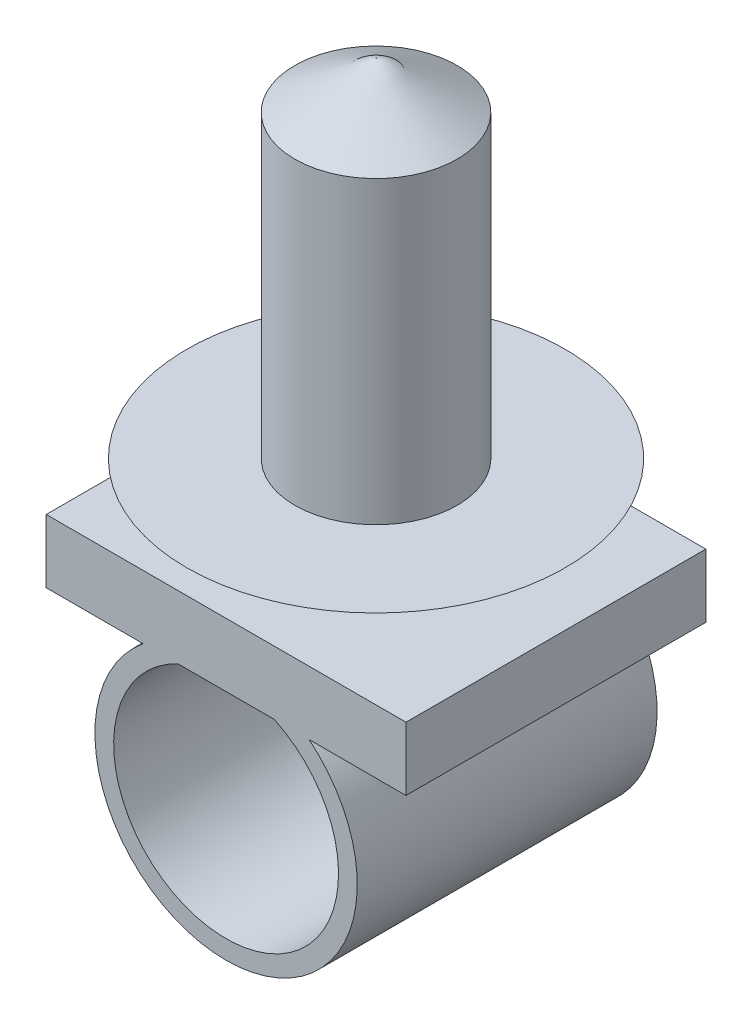
ISO-10303-21;
HEADER;
FILE_DESCRIPTION(('STEP AP214'),'2;1');
FILE_NAME('part.step','',(''),(''),'','','');
FILE_SCHEMA(('AUTOMOTIVE_DESIGN { 1 0 10303 214 1 1 1 1 }'));
ENDSEC;
DATA;
#1=APPLICATION_CONTEXT('core data for automotive mechanical design processes');
#2=APPLICATION_PROTOCOL_DEFINITION('international standard','automotive_design',2000,#1);
#3=PRODUCT_CONTEXT('',#1,'mechanical');
#4=PRODUCT('Part','Part','',(#3));
#5=PRODUCT_RELATED_PRODUCT_CATEGORY('part','',(#4));
#6=PRODUCT_DEFINITION_FORMATION('','',#4);
#7=PRODUCT_DEFINITION_CONTEXT('part definition',#1,'design');
#8=PRODUCT_DEFINITION('design','',#6,#7);
#9=PRODUCT_DEFINITION_SHAPE('','',#8);
#10=(LENGTH_UNIT() NAMED_UNIT(*) SI_UNIT(.MILLI.,.METRE.));
#11=(NAMED_UNIT(*) PLANE_ANGLE_UNIT() SI_UNIT($,.RADIAN.));
#12=(NAMED_UNIT(*) SI_UNIT($,.STERADIAN.) SOLID_ANGLE_UNIT());
#13=UNCERTAINTY_MEASURE_WITH_UNIT(LENGTH_MEASURE(1.E-05),#10,'distance_accuracy_value','');
#14=(GEOMETRIC_REPRESENTATION_CONTEXT(3) GLOBAL_UNCERTAINTY_ASSIGNED_CONTEXT((#13)) GLOBAL_UNIT_ASSIGNED_CONTEXT((#10,
#11,#12)) REPRESENTATION_CONTEXT('',''));
#15=CARTESIAN_POINT('',(0.,0.,0.));
#16=DIRECTION('',(0.,0.,1.));
#17=DIRECTION('',(1.,0.,0.));
#18=AXIS2_PLACEMENT_3D('',#15,#16,#17);
#19=CARTESIAN_POINT('',(0.,0.,12.));
#20=DIRECTION('',(0.,0.,1.));
#21=DIRECTION('',(1.,0.,0.));
#22=AXIS2_PLACEMENT_3D('',#19,#20,#21);
#23=PLANE('',#22);
#24=CARTESIAN_POINT('',(0.,0.,12.));
#25=DIRECTION('',(0.,0.,1.));
#26=DIRECTION('',(1.,0.,0.));
#27=AXIS2_PLACEMENT_3D('',#24,#25,#26);
#28=CIRCLE('',#27,4.5);
#29=CARTESIAN_POINT('',(-1.93233123454546,4.064,12.));
#30=VERTEX_POINT('',#29);
#31=CARTESIAN_POINT('',(1.93233123454546,4.064,12.));
#32=VERTEX_POINT('',#31);
#33=EDGE_CURVE('E185',#30,#32,#28,.T.);
#34=ORIENTED_EDGE('',*,*,#33,.F.);
#35=DIRECTION('',(1.,0.,0.));
#36=VECTOR('',#35,1.);
#37=CARTESIAN_POINT('',(7.2,4.064,12.));
#38=LINE('',#37,#36);
#39=EDGE_CURVE('E155',#30,#32,#38,.T.);
#40=ORIENTED_EDGE('',*,*,#39,.T.);
#41=EDGE_LOOP('',(#34,#40));
#42=FACE_BOUND('',#41,.T.);
#43=CARTESIAN_POINT('',(-7.2,4.064,12.));
#44=VERTEX_POINT('',#43);
#45=CARTESIAN_POINT('',(-3.32361309420937,4.064,12.));
#46=VERTEX_POINT('',#45);
#47=EDGE_CURVE('E150',#44,#46,#38,.T.);
#48=ORIENTED_EDGE('',*,*,#47,.T.);
#49=CARTESIAN_POINT('',(0.,0.,12.));
#50=DIRECTION('',(0.,0.,1.));
#51=DIRECTION('',(1.,0.,0.));
#52=AXIS2_PLACEMENT_3D('',#49,#50,#51);
#53=CIRCLE('',#52,5.25);
#54=CARTESIAN_POINT('',(3.32361309420937,4.064,12.));
#55=VERTEX_POINT('',#54);
#56=EDGE_CURVE('E191',#46,#55,#53,.T.);
#57=ORIENTED_EDGE('',*,*,#56,.T.);
#58=CARTESIAN_POINT('',(7.2,4.064,12.));
#59=VERTEX_POINT('',#58);
#60=EDGE_CURVE('E61',#55,#59,#38,.T.);
#61=ORIENTED_EDGE('',*,*,#60,.T.);
#62=DIRECTION('',(0.,-1.,0.));
#63=VECTOR('',#62,1.);
#64=CARTESIAN_POINT('',(7.2,6.604,12.));
#65=LINE('',#64,#63);
#66=CARTESIAN_POINT('',(7.2,6.604,12.));
#67=VERTEX_POINT('',#66);
#68=EDGE_CURVE('E166',#67,#59,#65,.T.);
#69=ORIENTED_EDGE('',*,*,#68,.F.);
#70=DIRECTION('',(1.,0.,0.));
#71=VECTOR('',#70,1.);
#72=CARTESIAN_POINT('',(7.2,6.604,12.));
#73=LINE('',#72,#71);
#74=CARTESIAN_POINT('',(-7.2,6.604,12.));
#75=VERTEX_POINT('',#74);
#76=EDGE_CURVE('E140',#75,#67,#73,.T.);
#77=ORIENTED_EDGE('',*,*,#76,.F.);
#78=DIRECTION('',(0.,-1.,0.));
#79=VECTOR('',#78,1.);
#80=CARTESIAN_POINT('',(-7.2,6.604,12.));
#81=LINE('',#80,#79);
#82=EDGE_CURVE('E170',#75,#44,#81,.T.);
#83=ORIENTED_EDGE('',*,*,#82,.T.);
#84=EDGE_LOOP('',(#48,#57,#61,#69,#77,#83));
#85=FACE_BOUND('',#84,.T.);
#86=ADVANCED_FACE('F43',(#42,#85),#23,.T.);
#87=CARTESIAN_POINT('',(0.,0.,0.));
#88=DIRECTION('',(0.,0.,1.));
#89=DIRECTION('',(1.,0.,0.));
#90=AXIS2_PLACEMENT_3D('',#87,#88,#89);
#91=PLANE('',#90);
#92=DIRECTION('',(-1.,0.,0.));
#93=VECTOR('',#92,1.);
#94=CARTESIAN_POINT('',(0.,4.064,0.));
#95=LINE('',#94,#93);
#96=CARTESIAN_POINT('',(1.93233123454546,4.064,0.));
#97=VERTEX_POINT('',#96);
#98=CARTESIAN_POINT('',(-1.93233123454546,4.064,0.));
#99=VERTEX_POINT('',#98);
#100=EDGE_CURVE('E162',#97,#99,#95,.T.);
#101=ORIENTED_EDGE('',*,*,#100,.T.);
#102=CARTESIAN_POINT('',(0.,0.,0.));
#103=DIRECTION('',(0.,0.,1.));
#104=DIRECTION('',(1.,0.,0.));
#105=AXIS2_PLACEMENT_3D('',#102,#103,#104);
#106=CIRCLE('',#105,4.5);
#107=EDGE_CURVE('E69',#99,#97,#106,.T.);
#108=ORIENTED_EDGE('',*,*,#107,.T.);
#109=EDGE_LOOP('',(#101,#108));
#110=FACE_BOUND('',#109,.T.);
#111=CARTESIAN_POINT('',(0.,0.,0.));
#112=DIRECTION('',(0.,0.,1.));
#113=DIRECTION('',(1.,0.,0.));
#114=AXIS2_PLACEMENT_3D('',#111,#112,#113);
#115=CIRCLE('',#114,5.25);
#116=CARTESIAN_POINT('',(-3.32361309420937,4.064,0.));
#117=VERTEX_POINT('',#116);
#118=CARTESIAN_POINT('',(3.32361309420937,4.064,0.));
#119=VERTEX_POINT('',#118);
#120=EDGE_CURVE('E188',#117,#119,#115,.T.);
#121=ORIENTED_EDGE('',*,*,#120,.F.);
#122=CARTESIAN_POINT('',(-7.2,4.064,0.));
#123=VERTEX_POINT('',#122);
#124=EDGE_CURVE('E158',#117,#123,#95,.T.);
#125=ORIENTED_EDGE('',*,*,#124,.T.);
#126=DIRECTION('',(0.,-1.,0.));
#127=VECTOR('',#126,1.);
#128=CARTESIAN_POINT('',(-7.2,6.604,0.));
#129=LINE('',#128,#127);
#130=CARTESIAN_POINT('',(-7.2,6.604,0.));
#131=VERTEX_POINT('',#130);
#132=EDGE_CURVE('E174',#131,#123,#129,.T.);
#133=ORIENTED_EDGE('',*,*,#132,.F.);
#134=DIRECTION('',(-1.,0.,0.));
#135=VECTOR('',#134,1.);
#136=CARTESIAN_POINT('',(-7.2,6.604,0.));
#137=LINE('',#136,#135);
#138=CARTESIAN_POINT('',(7.2,6.604,0.));
#139=VERTEX_POINT('',#138);
#140=EDGE_CURVE('E132',#139,#131,#137,.T.);
#141=ORIENTED_EDGE('',*,*,#140,.F.);
#142=DIRECTION('',(0.,-1.,0.));
#143=VECTOR('',#142,1.);
#144=CARTESIAN_POINT('',(7.2,6.604,0.));
#145=LINE('',#144,#143);
#146=CARTESIAN_POINT('',(7.2,4.064,0.));
#147=VERTEX_POINT('',#146);
#148=EDGE_CURVE('E147',#139,#147,#145,.T.);
#149=ORIENTED_EDGE('',*,*,#148,.T.);
#150=EDGE_CURVE('E137',#147,#119,#95,.T.);
#151=ORIENTED_EDGE('',*,*,#150,.T.);
#152=EDGE_LOOP('',(#121,#125,#133,#141,#149,#151));
#153=FACE_BOUND('',#152,.T.);
#154=ADVANCED_FACE('F209',(#110,#153),#91,.F.);
#155=CARTESIAN_POINT('',(0.,0.,12.));
#156=DIRECTION('',(0.,0.,-1.));
#157=DIRECTION('',(-1.,0.,0.));
#158=AXIS2_PLACEMENT_3D('',#155,#156,#157);
#159=CYLINDRICAL_SURFACE('',#158,5.25);
#160=ORIENTED_EDGE('',*,*,#56,.F.);
#161=DIRECTION('',(0.,0.,-1.));
#162=VECTOR('',#161,1.);
#163=CARTESIAN_POINT('',(-3.32361309420937,4.064,12.));
#164=LINE('',#163,#162);
#165=EDGE_CURVE('E181',#46,#117,#164,.T.);
#166=ORIENTED_EDGE('',*,*,#165,.T.);
#167=ORIENTED_EDGE('',*,*,#120,.T.);
#168=DIRECTION('',(0.,0.,-1.));
#169=VECTOR('',#168,1.);
#170=CARTESIAN_POINT('',(3.32361309420937,4.064,12.));
#171=LINE('',#170,#169);
#172=EDGE_CURVE('E178',#119,#55,#171,.F.);
#173=ORIENTED_EDGE('',*,*,#172,.T.);
#174=EDGE_LOOP('',(#160,#166,#167,#173));
#175=FACE_BOUND('',#174,.T.);
#176=ADVANCED_FACE('F45',(#175),#159,.T.);
#177=CARTESIAN_POINT('',(0.,0.,12.));
#178=DIRECTION('',(0.,0.,-1.));
#179=DIRECTION('',(-1.,0.,0.));
#180=AXIS2_PLACEMENT_3D('',#177,#178,#179);
#181=CYLINDRICAL_SURFACE('',#180,4.5);
#182=DIRECTION('',(0.,0.,-1.));
#183=VECTOR('',#182,1.);
#184=CARTESIAN_POINT('',(-1.93233123454546,4.064,12.));
#185=LINE('',#184,#183);
#186=EDGE_CURVE('E47',#30,#99,#185,.T.);
#187=ORIENTED_EDGE('',*,*,#186,.F.);
#188=ORIENTED_EDGE('',*,*,#33,.T.);
#189=DIRECTION('',(0.,0.,-1.));
#190=VECTOR('',#189,1.);
#191=CARTESIAN_POINT('',(1.93233123454546,4.064,12.));
#192=LINE('',#191,#190);
#193=EDGE_CURVE('E195',#97,#32,#192,.F.);
#194=ORIENTED_EDGE('',*,*,#193,.F.);
#195=ORIENTED_EDGE('',*,*,#107,.F.);
#196=EDGE_LOOP('',(#187,#188,#194,#195));
#197=FACE_BOUND('',#196,.T.);
#198=ADVANCED_FACE('F253',(#197),#181,.F.);
#199=CARTESIAN_POINT('',(0.,4.064,0.));
#200=DIRECTION('',(0.,-1.,0.));
#201=DIRECTION('',(0.,0.,-1.));
#202=AXIS2_PLACEMENT_3D('',#199,#200,#201);
#203=PLANE('',#202);
#204=ORIENTED_EDGE('',*,*,#39,.F.);
#205=ORIENTED_EDGE('',*,*,#186,.T.);
#206=ORIENTED_EDGE('',*,*,#100,.F.);
#207=ORIENTED_EDGE('',*,*,#193,.T.);
#208=EDGE_LOOP('',(#204,#205,#206,#207));
#209=FACE_BOUND('',#208,.T.);
#210=ADVANCED_FACE('F206',(#209),#203,.T.);
#211=ORIENTED_EDGE('',*,*,#165,.F.);
#212=ORIENTED_EDGE('',*,*,#47,.F.);
#213=DIRECTION('',(0.,0.,1.));
#214=VECTOR('',#213,1.);
#215=CARTESIAN_POINT('',(-7.2,4.064,12.));
#216=LINE('',#215,#214);
#217=EDGE_CURVE('E126',#123,#44,#216,.T.);
#218=ORIENTED_EDGE('',*,*,#217,.F.);
#219=ORIENTED_EDGE('',*,*,#124,.F.);
#220=EDGE_LOOP('',(#211,#212,#218,#219));
#221=FACE_BOUND('',#220,.T.);
#222=ADVANCED_FACE('F218',(#221),#203,.T.);
#223=ORIENTED_EDGE('',*,*,#172,.F.);
#224=ORIENTED_EDGE('',*,*,#150,.F.);
#225=DIRECTION('',(0.,0.,-1.));
#226=VECTOR('',#225,1.);
#227=CARTESIAN_POINT('',(7.2,4.064,0.));
#228=LINE('',#227,#226);
#229=EDGE_CURVE('E154',#59,#147,#228,.T.);
#230=ORIENTED_EDGE('',*,*,#229,.F.);
#231=ORIENTED_EDGE('',*,*,#60,.F.);
#232=EDGE_LOOP('',(#223,#224,#230,#231));
#233=FACE_BOUND('',#232,.T.);
#234=ADVANCED_FACE('F229',(#233),#203,.T.);
#235=CARTESIAN_POINT('',(-7.2,6.604,12.));
#236=DIRECTION('',(1.,0.,0.));
#237=DIRECTION('',(0.,0.,-1.));
#238=AXIS2_PLACEMENT_3D('',#235,#236,#237);
#239=PLANE('',#238);
#240=ORIENTED_EDGE('',*,*,#217,.T.);
#241=ORIENTED_EDGE('',*,*,#82,.F.);
#242=DIRECTION('',(0.,0.,1.));
#243=VECTOR('',#242,1.);
#244=CARTESIAN_POINT('',(-7.2,6.604,12.));
#245=LINE('',#244,#243);
#246=EDGE_CURVE('E136',#131,#75,#245,.T.);
#247=ORIENTED_EDGE('',*,*,#246,.F.);
#248=ORIENTED_EDGE('',*,*,#132,.T.);
#249=EDGE_LOOP('',(#240,#241,#247,#248));
#250=FACE_BOUND('',#249,.T.);
#251=ADVANCED_FACE('F221',(#250),#239,.F.);
#252=CARTESIAN_POINT('',(7.2,6.604,0.));
#253=DIRECTION('',(-1.,0.,0.));
#254=DIRECTION('',(0.,0.,1.));
#255=AXIS2_PLACEMENT_3D('',#252,#253,#254);
#256=PLANE('',#255);
#257=ORIENTED_EDGE('',*,*,#229,.T.);
#258=ORIENTED_EDGE('',*,*,#148,.F.);
#259=DIRECTION('',(0.,0.,-1.));
#260=VECTOR('',#259,1.);
#261=CARTESIAN_POINT('',(7.2,6.604,0.));
#262=LINE('',#261,#260);
#263=EDGE_CURVE('E143',#67,#139,#262,.T.);
#264=ORIENTED_EDGE('',*,*,#263,.F.);
#265=ORIENTED_EDGE('',*,*,#68,.T.);
#266=EDGE_LOOP('',(#257,#258,#264,#265));
#267=FACE_BOUND('',#266,.T.);
#268=ADVANCED_FACE('F234',(#267),#256,.F.);
#269=CARTESIAN_POINT('',(0.,6.604,0.));
#270=DIRECTION('',(0.,-1.,0.));
#271=DIRECTION('',(0.,0.,-1.));
#272=AXIS2_PLACEMENT_3D('',#269,#270,#271);
#273=PLANE('',#272);
#274=CARTESIAN_POINT('',(0.,6.604,6.));
#275=DIRECTION('',(0.,1.,0.));
#276=DIRECTION('',(0.,0.,1.));
#277=AXIS2_PLACEMENT_3D('',#274,#275,#276);
#278=CIRCLE('',#277,3.175);
#279=CARTESIAN_POINT('',(0.,6.604,9.175));
#280=VERTEX_POINT('',#279);
#281=EDGE_CURVE('E53',#280,#280,#278,.T.);
#282=ORIENTED_EDGE('',*,*,#281,.F.);
#283=EDGE_LOOP('',(#282));
#284=FACE_BOUND('',#283,.T.);
#285=ORIENTED_EDGE('',*,*,#140,.T.);
#286=ORIENTED_EDGE('',*,*,#246,.T.);
#287=ORIENTED_EDGE('',*,*,#76,.T.);
#288=ORIENTED_EDGE('',*,*,#263,.T.);
#289=EDGE_LOOP('',(#285,#286,#287,#288));
#290=FACE_BOUND('',#289,.T.);
#291=ADVANCED_FACE('F224',(#284,#290),#273,.F.);
#292=CARTESIAN_POINT('',(0.,6.604,6.));
#293=DIRECTION('',(0.,1.,0.));
#294=DIRECTION('',(0.,0.,1.));
#295=AXIS2_PLACEMENT_3D('',#292,#293,#294);
#296=CONICAL_SURFACE('',#295,3.175,1.0471975511966);
#297=CARTESIAN_POINT('',(0.,9.144,6.));
#298=DIRECTION('',(0.,1.,0.));
#299=DIRECTION('',(0.,0.,1.));
#300=AXIS2_PLACEMENT_3D('',#297,#298,#299);
#301=CIRCLE('',#300,7.57440905122497);
#302=CARTESIAN_POINT('',(0.,9.144,13.574409051225));
#303=VERTEX_POINT('',#302);
#304=EDGE_CURVE('E122',#303,#303,#301,.T.);
#305=ORIENTED_EDGE('',*,*,#304,.F.);
#306=EDGE_LOOP('',(#305));
#307=FACE_BOUND('',#306,.T.);
#308=ORIENTED_EDGE('',*,*,#281,.T.);
#309=EDGE_LOOP('',(#308));
#310=FACE_BOUND('',#309,.T.);
#311=ADVANCED_FACE('F241',(#307,#310),#296,.T.);
#312=CARTESIAN_POINT('',(0.,9.144,6.));
#313=DIRECTION('',(0.,1.,0.));
#314=DIRECTION('',(0.,0.,1.));
#315=AXIS2_PLACEMENT_3D('',#312,#313,#314);
#316=PLANE('',#315);
#317=CARTESIAN_POINT('',(0.,9.144,6.));
#318=DIRECTION('',(0.,1.,0.));
#319=DIRECTION('',(0.,0.,1.));
#320=AXIS2_PLACEMENT_3D('',#317,#318,#319);
#321=CIRCLE('',#320,3.25);
#322=CARTESIAN_POINT('',(0.,9.144,9.25));
#323=VERTEX_POINT('',#322);
#324=EDGE_CURVE('E11',#323,#323,#321,.T.);
#325=ORIENTED_EDGE('',*,*,#324,.F.);
#326=EDGE_LOOP('',(#325));
#327=FACE_BOUND('',#326,.T.);
#328=ORIENTED_EDGE('',*,*,#304,.T.);
#329=EDGE_LOOP('',(#328));
#330=FACE_BOUND('',#329,.T.);
#331=ADVANCED_FACE('F336',(#327,#330),#316,.T.);
#332=CARTESIAN_POINT('',(0.,21.144,6.));
#333=DIRECTION('',(0.,-1.,0.));
#334=DIRECTION('',(0.,0.,-1.));
#335=AXIS2_PLACEMENT_3D('',#332,#333,#334);
#336=CYLINDRICAL_SURFACE('',#335,3.25);
#337=CARTESIAN_POINT('',(0.,21.144,6.));
#338=DIRECTION('',(0.,1.,0.));
#339=DIRECTION('',(0.,0.,1.));
#340=AXIS2_PLACEMENT_3D('',#337,#338,#339);
#341=CIRCLE('',#340,3.25);
#342=CARTESIAN_POINT('',(0.,21.144,9.25));
#343=VERTEX_POINT('',#342);
#344=EDGE_CURVE('E119',#343,#343,#341,.T.);
#345=ORIENTED_EDGE('',*,*,#344,.F.);
#346=EDGE_LOOP('',(#345));
#347=FACE_BOUND('',#346,.T.);
#348=ORIENTED_EDGE('',*,*,#324,.T.);
#349=EDGE_LOOP('',(#348));
#350=FACE_BOUND('',#349,.T.);
#351=ADVANCED_FACE('F115',(#347,#350),#336,.T.);
#352=CARTESIAN_POINT('',(0.,21.144,6.));
#353=DIRECTION('',(0.,-1.,0.));
#354=DIRECTION('',(0.,0.,1.));
#355=AXIS2_PLACEMENT_3D('',#352,#353,#354);
#356=CONICAL_SURFACE('',#355,3.25,1.0471975511966);
#357=CARTESIAN_POINT('',(0.,23.0203883748663,6.));
#358=VERTEX_POINT('',#357);
#359=VERTEX_LOOP('',#358);
#360=FACE_BOUND('',#359,.T.);
#361=ORIENTED_EDGE('',*,*,#344,.T.);
#362=EDGE_LOOP('',(#361));
#363=FACE_BOUND('',#362,.T.);
#364=ADVANCED_FACE('F112',(#360,#363),#356,.T.);
#365=CLOSED_SHELL('',(#86,#154,#176,#198,#210,#222,#234,#251,#268,#291,#311,#331,#351,#364));
#366=MANIFOLD_SOLID_BREP('B2',#365);
#367=ADVANCED_BREP_SHAPE_REPRESENTATION('',(#18,#366),#14);
#368=SHAPE_DEFINITION_REPRESENTATION(#9,#367);
ENDSEC;
END-ISO-10303-21;
